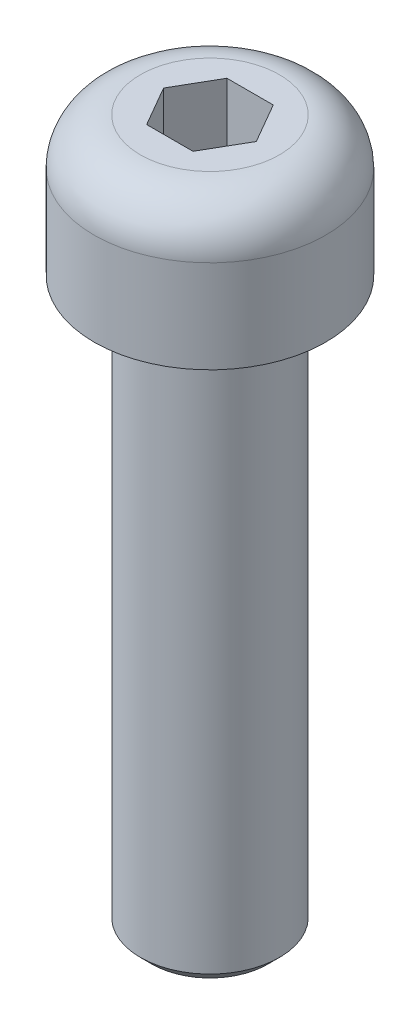
ISO-10303-21;
HEADER;
FILE_DESCRIPTION(('STEP AP214'),'2;1');
FILE_NAME('part.step','',(''),(''),'','','');
FILE_SCHEMA(('AUTOMOTIVE_DESIGN { 1 0 10303 214 1 1 1 1 }'));
ENDSEC;
DATA;
#1=APPLICATION_CONTEXT('core data for automotive mechanical design processes');
#2=APPLICATION_PROTOCOL_DEFINITION('international standard','automotive_design',2000,#1);
#3=PRODUCT_CONTEXT('',#1,'mechanical');
#4=PRODUCT('Part','Part','',(#3));
#5=PRODUCT_RELATED_PRODUCT_CATEGORY('part','',(#4));
#6=PRODUCT_DEFINITION_FORMATION('','',#4);
#7=PRODUCT_DEFINITION_CONTEXT('part definition',#1,'design');
#8=PRODUCT_DEFINITION('design','',#6,#7);
#9=PRODUCT_DEFINITION_SHAPE('','',#8);
#10=(LENGTH_UNIT() NAMED_UNIT(*) SI_UNIT(.MILLI.,.METRE.));
#11=(NAMED_UNIT(*) PLANE_ANGLE_UNIT() SI_UNIT($,.RADIAN.));
#12=(NAMED_UNIT(*) SI_UNIT($,.STERADIAN.) SOLID_ANGLE_UNIT());
#13=UNCERTAINTY_MEASURE_WITH_UNIT(LENGTH_MEASURE(1.E-05),#10,'distance_accuracy_value','');
#14=(GEOMETRIC_REPRESENTATION_CONTEXT(3) GLOBAL_UNCERTAINTY_ASSIGNED_CONTEXT((#13)) GLOBAL_UNIT_ASSIGNED_CONTEXT((#10,
#11,#12)) REPRESENTATION_CONTEXT('',''));
#15=CARTESIAN_POINT('',(0.,0.,0.));
#16=DIRECTION('',(0.,0.,1.));
#17=DIRECTION('',(1.,0.,0.));
#18=AXIS2_PLACEMENT_3D('',#15,#16,#17);
#19=CARTESIAN_POINT('',(0.,12.25,0.));
#20=DIRECTION('',(0.,-1.,0.));
#21=DIRECTION('',(0.,0.,-1.));
#22=AXIS2_PLACEMENT_3D('',#19,#20,#21);
#23=CYLINDRICAL_SURFACE('',#22,1.5);
#24=CARTESIAN_POINT('',(0.,0.250000000000002,0.));
#25=DIRECTION('',(0.,1.,0.));
#26=DIRECTION('',(0.,0.,1.));
#27=AXIS2_PLACEMENT_3D('',#24,#25,#26);
#28=CIRCLE('',#27,1.5);
#29=CARTESIAN_POINT('',(0.,0.250000000000002,1.5));
#30=VERTEX_POINT('',#29);
#31=EDGE_CURVE('E49',#30,#30,#28,.T.);
#32=ORIENTED_EDGE('',*,*,#31,.T.);
#33=EDGE_LOOP('',(#32));
#34=FACE_BOUND('',#33,.T.);
#35=CARTESIAN_POINT('',(0.,12.25,0.));
#36=DIRECTION('',(0.,1.,0.));
#37=DIRECTION('',(0.,0.,1.));
#38=AXIS2_PLACEMENT_3D('',#35,#36,#37);
#39=CIRCLE('',#38,1.5);
#40=CARTESIAN_POINT('',(0.,12.25,1.5));
#41=VERTEX_POINT('',#40);
#42=EDGE_CURVE('E151',#41,#41,#39,.T.);
#43=ORIENTED_EDGE('',*,*,#42,.F.);
#44=EDGE_LOOP('',(#43));
#45=FACE_BOUND('',#44,.T.);
#46=ADVANCED_FACE('F41',(#34,#45),#23,.T.);
#47=CARTESIAN_POINT('',(0.,0.,0.));
#48=DIRECTION('',(0.,1.,0.));
#49=DIRECTION('',(0.,0.,1.));
#50=AXIS2_PLACEMENT_3D('',#47,#48,#49);
#51=PLANE('',#50);
#52=CARTESIAN_POINT('',(0.,0.,0.));
#53=DIRECTION('',(0.,1.,0.));
#54=DIRECTION('',(0.,0.,1.));
#55=AXIS2_PLACEMENT_3D('',#52,#53,#54);
#56=CIRCLE('',#55,1.25);
#57=CARTESIAN_POINT('',(0.,0.,1.25));
#58=VERTEX_POINT('',#57);
#59=EDGE_CURVE('E11',#58,#58,#56,.F.);
#60=ORIENTED_EDGE('',*,*,#59,.T.);
#61=EDGE_LOOP('',(#60));
#62=FACE_BOUND('',#61,.T.);
#63=ADVANCED_FACE('F180',(#62),#51,.F.);
#64=CARTESIAN_POINT('',(0.,15.25,0.));
#65=DIRECTION('',(0.,-1.,0.));
#66=DIRECTION('',(0.,0.,-1.));
#67=AXIS2_PLACEMENT_3D('',#64,#65,#66);
#68=CYLINDRICAL_SURFACE('',#67,2.5);
#69=CARTESIAN_POINT('',(0.,14.25,0.));
#70=DIRECTION('',(0.,1.,0.));
#71=DIRECTION('',(0.,0.,1.));
#72=AXIS2_PLACEMENT_3D('',#69,#70,#71);
#73=CIRCLE('',#72,2.5);
#74=CARTESIAN_POINT('',(0.,14.25,2.5));
#75=VERTEX_POINT('',#74);
#76=EDGE_CURVE('E157',#75,#75,#73,.F.);
#77=ORIENTED_EDGE('',*,*,#76,.T.);
#78=EDGE_LOOP('',(#77));
#79=FACE_BOUND('',#78,.T.);
#80=CARTESIAN_POINT('',(0.,12.25,0.));
#81=DIRECTION('',(0.,1.,0.));
#82=DIRECTION('',(0.,0.,1.));
#83=AXIS2_PLACEMENT_3D('',#80,#81,#82);
#84=CIRCLE('',#83,2.5);
#85=CARTESIAN_POINT('',(0.,12.25,2.5));
#86=VERTEX_POINT('',#85);
#87=EDGE_CURVE('E143',#86,#86,#84,.T.);
#88=ORIENTED_EDGE('',*,*,#87,.T.);
#89=EDGE_LOOP('',(#88));
#90=FACE_BOUND('',#89,.T.);
#91=ADVANCED_FACE('F184',(#79,#90),#68,.T.);
#92=CARTESIAN_POINT('',(0.,15.25,0.));
#93=DIRECTION('',(0.,1.,0.));
#94=DIRECTION('',(0.,0.,1.));
#95=AXIS2_PLACEMENT_3D('',#92,#93,#94);
#96=PLANE('',#95);
#97=DIRECTION('',(-0.499999999999999,0.,0.866025403784439));
#98=VECTOR('',#97,1.);
#99=CARTESIAN_POINT('',(-0.5,15.25,-0.866025403784439));
#100=LINE('',#99,#98);
#101=CARTESIAN_POINT('',(-0.5,15.25,-0.866025403784439));
#102=VERTEX_POINT('',#101);
#103=CARTESIAN_POINT('',(-1.,15.25,0.));
#104=VERTEX_POINT('',#103);
#105=EDGE_CURVE('E56',#102,#104,#100,.T.);
#106=ORIENTED_EDGE('',*,*,#105,.F.);
#107=DIRECTION('',(-1.,0.,0.));
#108=VECTOR('',#107,1.);
#109=CARTESIAN_POINT('',(0.5,15.25,-0.866025403784439));
#110=LINE('',#109,#108);
#111=CARTESIAN_POINT('',(0.5,15.25,-0.866025403784439));
#112=VERTEX_POINT('',#111);
#113=EDGE_CURVE('E139',#112,#102,#110,.T.);
#114=ORIENTED_EDGE('',*,*,#113,.F.);
#115=DIRECTION('',(-0.5,0.,-0.866025403784439));
#116=VECTOR('',#115,1.);
#117=CARTESIAN_POINT('',(1.,15.25,0.));
#118=LINE('',#117,#116);
#119=CARTESIAN_POINT('',(1.,15.25,0.));
#120=VERTEX_POINT('',#119);
#121=EDGE_CURVE('E137',#120,#112,#118,.T.);
#122=ORIENTED_EDGE('',*,*,#121,.F.);
#123=DIRECTION('',(0.5,0.,-0.866025403784439));
#124=VECTOR('',#123,1.);
#125=CARTESIAN_POINT('',(0.5,15.25,0.866025403784439));
#126=LINE('',#125,#124);
#127=CARTESIAN_POINT('',(0.5,15.25,0.866025403784439));
#128=VERTEX_POINT('',#127);
#129=EDGE_CURVE('E104',#128,#120,#126,.T.);
#130=ORIENTED_EDGE('',*,*,#129,.F.);
#131=DIRECTION('',(1.,0.,0.));
#132=VECTOR('',#131,1.);
#133=CARTESIAN_POINT('',(-0.5,15.25,0.866025403784439));
#134=LINE('',#133,#132);
#135=CARTESIAN_POINT('',(-0.5,15.25,0.866025403784439));
#136=VERTEX_POINT('',#135);
#137=EDGE_CURVE('E133',#136,#128,#134,.T.);
#138=ORIENTED_EDGE('',*,*,#137,.F.);
#139=DIRECTION('',(0.5,0.,0.866025403784439));
#140=VECTOR('',#139,1.);
#141=CARTESIAN_POINT('',(-1.,15.25,0.));
#142=LINE('',#141,#140);
#143=EDGE_CURVE('E130',#104,#136,#142,.T.);
#144=ORIENTED_EDGE('',*,*,#143,.F.);
#145=EDGE_LOOP('',(#106,#114,#122,#130,#138,#144));
#146=FACE_BOUND('',#145,.T.);
#147=CARTESIAN_POINT('',(0.,15.25,0.));
#148=DIRECTION('',(0.,1.,0.));
#149=DIRECTION('',(0.,0.,1.));
#150=AXIS2_PLACEMENT_3D('',#147,#148,#149);
#151=CIRCLE('',#150,1.5);
#152=CARTESIAN_POINT('',(0.,15.25,1.5));
#153=VERTEX_POINT('',#152);
#154=EDGE_CURVE('E154',#153,#153,#151,.T.);
#155=ORIENTED_EDGE('',*,*,#154,.T.);
#156=EDGE_LOOP('',(#155));
#157=FACE_BOUND('',#156,.T.);
#158=ADVANCED_FACE('F190',(#146,#157),#96,.T.);
#159=CARTESIAN_POINT('',(0.,12.25,0.));
#160=DIRECTION('',(0.,1.,0.));
#161=DIRECTION('',(0.,0.,1.));
#162=AXIS2_PLACEMENT_3D('',#159,#160,#161);
#163=PLANE('',#162);
#164=ORIENTED_EDGE('',*,*,#42,.T.);
#165=EDGE_LOOP('',(#164));
#166=FACE_BOUND('',#165,.T.);
#167=ORIENTED_EDGE('',*,*,#87,.F.);
#168=EDGE_LOOP('',(#167));
#169=FACE_BOUND('',#168,.T.);
#170=ADVANCED_FACE('F176',(#166,#169),#163,.F.);
#171=CARTESIAN_POINT('',(0.,14.25,0.));
#172=DIRECTION('',(0.,1.,0.));
#173=DIRECTION('',(0.,0.,1.));
#174=AXIS2_PLACEMENT_3D('',#171,#172,#173);
#175=TOROIDAL_SURFACE('',#174,1.5,1.);
#176=ORIENTED_EDGE('',*,*,#76,.F.);
#177=EDGE_LOOP('',(#176));
#178=FACE_BOUND('',#177,.T.);
#179=ORIENTED_EDGE('',*,*,#154,.F.);
#180=EDGE_LOOP('',(#179));
#181=FACE_BOUND('',#180,.T.);
#182=ADVANCED_FACE('F166',(#178,#181),#175,.T.);
#183=CARTESIAN_POINT('',(0.,0.250000000000002,0.));
#184=DIRECTION('',(0.,1.,0.));
#185=DIRECTION('',(0.,0.,1.));
#186=AXIS2_PLACEMENT_3D('',#183,#184,#185);
#187=CONICAL_SURFACE('',#186,1.5,0.785398163397453);
#188=ORIENTED_EDGE('',*,*,#59,.F.);
#189=EDGE_LOOP('',(#188));
#190=FACE_BOUND('',#189,.T.);
#191=ORIENTED_EDGE('',*,*,#31,.F.);
#192=EDGE_LOOP('',(#191));
#193=FACE_BOUND('',#192,.T.);
#194=ADVANCED_FACE('F43',(#190,#193),#187,.T.);
#195=CARTESIAN_POINT('',(-0.5,13.25,-0.866025403784439));
#196=DIRECTION('',(-0.866025403784439,0.,-0.499999999999999));
#197=DIRECTION('',(-0.5,0.,0.866025403784439));
#198=AXIS2_PLACEMENT_3D('',#195,#196,#197);
#199=PLANE('',#198);
#200=ORIENTED_EDGE('',*,*,#105,.T.);
#201=DIRECTION('',(0.,1.,0.));
#202=VECTOR('',#201,1.);
#203=CARTESIAN_POINT('',(-1.,13.25,0.));
#204=LINE('',#203,#202);
#205=CARTESIAN_POINT('',(-1.,13.25,0.));
#206=VERTEX_POINT('',#205);
#207=EDGE_CURVE('E86',#206,#104,#204,.T.);
#208=ORIENTED_EDGE('',*,*,#207,.F.);
#209=DIRECTION('',(-0.499999999999999,0.,0.866025403784439));
#210=VECTOR('',#209,1.);
#211=CARTESIAN_POINT('',(-0.5,13.25,-0.866025403784439));
#212=LINE('',#211,#210);
#213=CARTESIAN_POINT('',(-0.5,13.25,-0.866025403784439));
#214=VERTEX_POINT('',#213);
#215=EDGE_CURVE('E141',#214,#206,#212,.T.);
#216=ORIENTED_EDGE('',*,*,#215,.F.);
#217=DIRECTION('',(0.,1.,0.));
#218=VECTOR('',#217,1.);
#219=CARTESIAN_POINT('',(-0.5,13.25,-0.866025403784439));
#220=LINE('',#219,#218);
#221=EDGE_CURVE('E64',#214,#102,#220,.T.);
#222=ORIENTED_EDGE('',*,*,#221,.T.);
#223=EDGE_LOOP('',(#200,#208,#216,#222));
#224=FACE_BOUND('',#223,.T.);
#225=ADVANCED_FACE('F165',(#224),#199,.F.);
#226=CARTESIAN_POINT('',(0.5,13.25,-0.866025403784439));
#227=DIRECTION('',(0.,0.,-1.));
#228=DIRECTION('',(-1.,0.,0.));
#229=AXIS2_PLACEMENT_3D('',#226,#227,#228);
#230=PLANE('',#229);
#231=ORIENTED_EDGE('',*,*,#113,.T.);
#232=ORIENTED_EDGE('',*,*,#221,.F.);
#233=DIRECTION('',(-1.,0.,0.));
#234=VECTOR('',#233,1.);
#235=CARTESIAN_POINT('',(0.5,13.25,-0.866025403784439));
#236=LINE('',#235,#234);
#237=CARTESIAN_POINT('',(0.5,13.25,-0.866025403784439));
#238=VERTEX_POINT('',#237);
#239=EDGE_CURVE('E116',#238,#214,#236,.T.);
#240=ORIENTED_EDGE('',*,*,#239,.F.);
#241=DIRECTION('',(0.,1.,0.));
#242=VECTOR('',#241,1.);
#243=CARTESIAN_POINT('',(0.5,13.25,-0.866025403784439));
#244=LINE('',#243,#242);
#245=EDGE_CURVE('E108',#238,#112,#244,.T.);
#246=ORIENTED_EDGE('',*,*,#245,.T.);
#247=EDGE_LOOP('',(#231,#232,#240,#246));
#248=FACE_BOUND('',#247,.T.);
#249=ADVANCED_FACE('F173',(#248),#230,.F.);
#250=CARTESIAN_POINT('',(1.,13.25,0.));
#251=DIRECTION('',(0.866025403784439,0.,-0.5));
#252=DIRECTION('',(-0.5,0.,-0.866025403784439));
#253=AXIS2_PLACEMENT_3D('',#250,#251,#252);
#254=PLANE('',#253);
#255=ORIENTED_EDGE('',*,*,#121,.T.);
#256=ORIENTED_EDGE('',*,*,#245,.F.);
#257=DIRECTION('',(-0.5,0.,-0.866025403784439));
#258=VECTOR('',#257,1.);
#259=CARTESIAN_POINT('',(1.,13.25,0.));
#260=LINE('',#259,#258);
#261=CARTESIAN_POINT('',(1.,13.25,0.));
#262=VERTEX_POINT('',#261);
#263=EDGE_CURVE('E112',#262,#238,#260,.T.);
#264=ORIENTED_EDGE('',*,*,#263,.F.);
#265=DIRECTION('',(0.,1.,0.));
#266=VECTOR('',#265,1.);
#267=CARTESIAN_POINT('',(1.,13.25,0.));
#268=LINE('',#267,#266);
#269=EDGE_CURVE('E97',#262,#120,#268,.T.);
#270=ORIENTED_EDGE('',*,*,#269,.T.);
#271=EDGE_LOOP('',(#255,#256,#264,#270));
#272=FACE_BOUND('',#271,.T.);
#273=ADVANCED_FACE('F113',(#272),#254,.F.);
#274=CARTESIAN_POINT('',(0.5,13.25,0.866025403784439));
#275=DIRECTION('',(0.866025403784439,0.,0.5));
#276=DIRECTION('',(0.5,0.,-0.866025403784439));
#277=AXIS2_PLACEMENT_3D('',#274,#275,#276);
#278=PLANE('',#277);
#279=ORIENTED_EDGE('',*,*,#129,.T.);
#280=ORIENTED_EDGE('',*,*,#269,.F.);
#281=DIRECTION('',(0.5,0.,-0.866025403784439));
#282=VECTOR('',#281,1.);
#283=CARTESIAN_POINT('',(0.5,13.25,0.866025403784439));
#284=LINE('',#283,#282);
#285=CARTESIAN_POINT('',(0.5,13.25,0.866025403784439));
#286=VERTEX_POINT('',#285);
#287=EDGE_CURVE('E101',#286,#262,#284,.T.);
#288=ORIENTED_EDGE('',*,*,#287,.F.);
#289=DIRECTION('',(0.,1.,0.));
#290=VECTOR('',#289,1.);
#291=CARTESIAN_POINT('',(0.5,13.25,0.866025403784439));
#292=LINE('',#291,#290);
#293=EDGE_CURVE('E109',#286,#128,#292,.T.);
#294=ORIENTED_EDGE('',*,*,#293,.T.);
#295=EDGE_LOOP('',(#279,#280,#288,#294));
#296=FACE_BOUND('',#295,.T.);
#297=ADVANCED_FACE('F99',(#296),#278,.F.);
#298=CARTESIAN_POINT('',(-0.5,13.25,0.866025403784439));
#299=DIRECTION('',(0.,0.,1.));
#300=DIRECTION('',(1.,0.,0.));
#301=AXIS2_PLACEMENT_3D('',#298,#299,#300);
#302=PLANE('',#301);
#303=ORIENTED_EDGE('',*,*,#137,.T.);
#304=ORIENTED_EDGE('',*,*,#293,.F.);
#305=DIRECTION('',(1.,0.,0.));
#306=VECTOR('',#305,1.);
#307=CARTESIAN_POINT('',(-0.5,13.25,0.866025403784439));
#308=LINE('',#307,#306);
#309=CARTESIAN_POINT('',(-0.5,13.25,0.866025403784439));
#310=VERTEX_POINT('',#309);
#311=EDGE_CURVE('E122',#310,#286,#308,.T.);
#312=ORIENTED_EDGE('',*,*,#311,.F.);
#313=DIRECTION('',(0.,1.,0.));
#314=VECTOR('',#313,1.);
#315=CARTESIAN_POINT('',(-0.5,13.25,0.866025403784439));
#316=LINE('',#315,#314);
#317=EDGE_CURVE('E146',#310,#136,#316,.T.);
#318=ORIENTED_EDGE('',*,*,#317,.T.);
#319=EDGE_LOOP('',(#303,#304,#312,#318));
#320=FACE_BOUND('',#319,.T.);
#321=ADVANCED_FACE('F200',(#320),#302,.F.);
#322=CARTESIAN_POINT('',(-1.,13.25,0.));
#323=DIRECTION('',(-0.866025403784439,0.,0.5));
#324=DIRECTION('',(0.5,0.,0.866025403784439));
#325=AXIS2_PLACEMENT_3D('',#322,#323,#324);
#326=PLANE('',#325);
#327=ORIENTED_EDGE('',*,*,#143,.T.);
#328=ORIENTED_EDGE('',*,*,#317,.F.);
#329=DIRECTION('',(0.5,0.,0.866025403784439));
#330=VECTOR('',#329,1.);
#331=CARTESIAN_POINT('',(-1.,13.25,0.));
#332=LINE('',#331,#330);
#333=EDGE_CURVE('E124',#206,#310,#332,.T.);
#334=ORIENTED_EDGE('',*,*,#333,.F.);
#335=ORIENTED_EDGE('',*,*,#207,.T.);
#336=EDGE_LOOP('',(#327,#328,#334,#335));
#337=FACE_BOUND('',#336,.T.);
#338=ADVANCED_FACE('F197',(#337),#326,.F.);
#339=CARTESIAN_POINT('',(0.,13.25,0.));
#340=DIRECTION('',(0.,1.,0.));
#341=DIRECTION('',(0.,0.,1.));
#342=AXIS2_PLACEMENT_3D('',#339,#340,#341);
#343=PLANE('',#342);
#344=ORIENTED_EDGE('',*,*,#215,.T.);
#345=ORIENTED_EDGE('',*,*,#333,.T.);
#346=ORIENTED_EDGE('',*,*,#311,.T.);
#347=ORIENTED_EDGE('',*,*,#287,.T.);
#348=ORIENTED_EDGE('',*,*,#263,.T.);
#349=ORIENTED_EDGE('',*,*,#239,.T.);
#350=EDGE_LOOP('',(#344,#345,#346,#347,#348,#349));
#351=FACE_BOUND('',#350,.T.);
#352=ADVANCED_FACE('F119',(#351),#343,.T.);
#353=CLOSED_SHELL('',(#46,#63,#91,#158,#170,#182,#194,#225,#249,#273,#297,#321,#338,#352));
#354=MANIFOLD_SOLID_BREP('B2',#353);
#355=ADVANCED_BREP_SHAPE_REPRESENTATION('',(#18,#354),#14);
#356=SHAPE_DEFINITION_REPRESENTATION(#9,#355);
ENDSEC;
END-ISO-10303-21;
